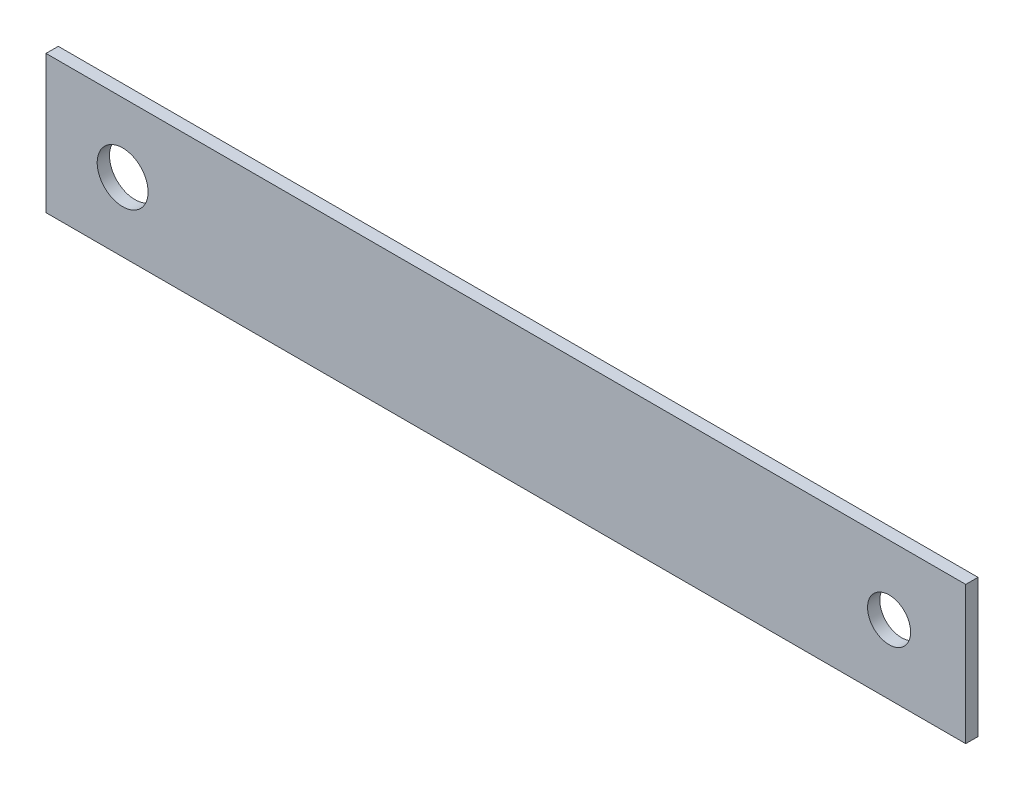
ISO-10303-21;
HEADER;
FILE_DESCRIPTION(('STEP AP214'),'2;1');
FILE_NAME('part.step','',(''),(''),'','','');
FILE_SCHEMA(('AUTOMOTIVE_DESIGN { 1 0 10303 214 1 1 1 1 }'));
ENDSEC;
DATA;
#1=APPLICATION_CONTEXT('core data for automotive mechanical design processes');
#2=APPLICATION_PROTOCOL_DEFINITION('international standard','automotive_design',2000,#1);
#3=PRODUCT_CONTEXT('',#1,'mechanical');
#4=PRODUCT('Part','Part','',(#3));
#5=PRODUCT_RELATED_PRODUCT_CATEGORY('part','',(#4));
#6=PRODUCT_DEFINITION_FORMATION('','',#4);
#7=PRODUCT_DEFINITION_CONTEXT('part definition',#1,'design');
#8=PRODUCT_DEFINITION('design','',#6,#7);
#9=PRODUCT_DEFINITION_SHAPE('','',#8);
#10=(LENGTH_UNIT() NAMED_UNIT(*) SI_UNIT(.MILLI.,.METRE.));
#11=(NAMED_UNIT(*) PLANE_ANGLE_UNIT() SI_UNIT($,.RADIAN.));
#12=(NAMED_UNIT(*) SI_UNIT($,.STERADIAN.) SOLID_ANGLE_UNIT());
#13=UNCERTAINTY_MEASURE_WITH_UNIT(LENGTH_MEASURE(1.E-05),#10,'distance_accuracy_value','');
#14=(GEOMETRIC_REPRESENTATION_CONTEXT(3) GLOBAL_UNCERTAINTY_ASSIGNED_CONTEXT((#13)) GLOBAL_UNIT_ASSIGNED_CONTEXT((#10,
#11,#12)) REPRESENTATION_CONTEXT('',''));
#15=CARTESIAN_POINT('',(0.,0.,0.));
#16=DIRECTION('',(0.,0.,1.));
#17=DIRECTION('',(1.,0.,0.));
#18=AXIS2_PLACEMENT_3D('',#15,#16,#17);
#19=CARTESIAN_POINT('',(-6.35,-5.715,1.016));
#20=DIRECTION('',(0.,0.,1.));
#21=DIRECTION('',(1.,0.,0.));
#22=AXIS2_PLACEMENT_3D('',#19,#20,#21);
#23=PLANE('',#22);
#24=CARTESIAN_POINT('',(0.,0.,1.016));
#25=DIRECTION('',(0.,0.,1.));
#26=DIRECTION('',(1.,0.,0.));
#27=AXIS2_PLACEMENT_3D('',#24,#25,#26);
#28=CIRCLE('',#27,2.1082);
#29=CARTESIAN_POINT('',(2.1082,0.,1.016));
#30=VERTEX_POINT('',#29);
#31=EDGE_CURVE('E103',#30,#30,#28,.T.);
#32=ORIENTED_EDGE('',*,*,#31,.F.);
#33=EDGE_LOOP('',(#32));
#34=FACE_BOUND('',#33,.T.);
#35=DIRECTION('',(0.,-1.,0.));
#36=VECTOR('',#35,1.);
#37=CARTESIAN_POINT('',(-6.35,5.715,1.016));
#38=LINE('',#37,#36);
#39=CARTESIAN_POINT('',(-6.35,5.715,1.016));
#40=VERTEX_POINT('',#39);
#41=CARTESIAN_POINT('',(-6.35,-5.715,1.016));
#42=VERTEX_POINT('',#41);
#43=EDGE_CURVE('E88',#40,#42,#38,.T.);
#44=ORIENTED_EDGE('',*,*,#43,.T.);
#45=DIRECTION('',(1.,0.,0.));
#46=VECTOR('',#45,1.);
#47=CARTESIAN_POINT('',(-6.35,-5.715,1.016));
#48=LINE('',#47,#46);
#49=CARTESIAN_POINT('',(69.85,-5.715,1.016));
#50=VERTEX_POINT('',#49);
#51=EDGE_CURVE('E83',#42,#50,#48,.T.);
#52=ORIENTED_EDGE('',*,*,#51,.T.);
#53=DIRECTION('',(0.,1.,0.));
#54=VECTOR('',#53,1.);
#55=CARTESIAN_POINT('',(69.85,5.715,1.016));
#56=LINE('',#55,#54);
#57=CARTESIAN_POINT('',(69.85,5.715,1.016));
#58=VERTEX_POINT('',#57);
#59=EDGE_CURVE('E86',#50,#58,#56,.T.);
#60=ORIENTED_EDGE('',*,*,#59,.T.);
#61=DIRECTION('',(-1.,0.,0.));
#62=VECTOR('',#61,1.);
#63=CARTESIAN_POINT('',(-6.35,5.715,1.016));
#64=LINE('',#63,#62);
#65=EDGE_CURVE('E53',#58,#40,#64,.T.);
#66=ORIENTED_EDGE('',*,*,#65,.T.);
#67=EDGE_LOOP('',(#44,#52,#60,#66));
#68=FACE_BOUND('',#67,.T.);
#69=CARTESIAN_POINT('',(63.5,0.,1.016));
#70=DIRECTION('',(0.,0.,1.));
#71=DIRECTION('',(1.,0.,0.));
#72=AXIS2_PLACEMENT_3D('',#69,#70,#71);
#73=CIRCLE('',#72,1.78562);
#74=CARTESIAN_POINT('',(65.28562,0.,1.016));
#75=VERTEX_POINT('',#74);
#76=EDGE_CURVE('E118',#75,#75,#73,.T.);
#77=ORIENTED_EDGE('',*,*,#76,.F.);
#78=EDGE_LOOP('',(#77));
#79=FACE_BOUND('',#78,.T.);
#80=ADVANCED_FACE('F36',(#34,#68,#79),#23,.T.);
#81=CARTESIAN_POINT('',(-6.35,-5.715,0.));
#82=DIRECTION('',(0.,0.,1.));
#83=DIRECTION('',(1.,0.,0.));
#84=AXIS2_PLACEMENT_3D('',#81,#82,#83);
#85=PLANE('',#84);
#86=CARTESIAN_POINT('',(0.,0.,0.));
#87=DIRECTION('',(0.,0.,1.));
#88=DIRECTION('',(1.,0.,0.));
#89=AXIS2_PLACEMENT_3D('',#86,#87,#88);
#90=CIRCLE('',#89,2.1082);
#91=CARTESIAN_POINT('',(2.1082,0.,0.));
#92=VERTEX_POINT('',#91);
#93=EDGE_CURVE('E115',#92,#92,#90,.T.);
#94=ORIENTED_EDGE('',*,*,#93,.T.);
#95=EDGE_LOOP('',(#94));
#96=FACE_BOUND('',#95,.T.);
#97=DIRECTION('',(0.,-1.,0.));
#98=VECTOR('',#97,1.);
#99=CARTESIAN_POINT('',(-6.35,5.715,0.));
#100=LINE('',#99,#98);
#101=CARTESIAN_POINT('',(-6.35,5.715,0.));
#102=VERTEX_POINT('',#101);
#103=CARTESIAN_POINT('',(-6.35,-5.715,0.));
#104=VERTEX_POINT('',#103);
#105=EDGE_CURVE('E100',#102,#104,#100,.T.);
#106=ORIENTED_EDGE('',*,*,#105,.F.);
#107=DIRECTION('',(-1.,0.,0.));
#108=VECTOR('',#107,1.);
#109=CARTESIAN_POINT('',(-6.35,5.715,0.));
#110=LINE('',#109,#108);
#111=CARTESIAN_POINT('',(69.85,5.715,0.));
#112=VERTEX_POINT('',#111);
#113=EDGE_CURVE('E76',#112,#102,#110,.T.);
#114=ORIENTED_EDGE('',*,*,#113,.F.);
#115=DIRECTION('',(0.,1.,0.));
#116=VECTOR('',#115,1.);
#117=CARTESIAN_POINT('',(69.85,5.715,0.));
#118=LINE('',#117,#116);
#119=CARTESIAN_POINT('',(69.85,-5.715,0.));
#120=VERTEX_POINT('',#119);
#121=EDGE_CURVE('E70',#120,#112,#118,.T.);
#122=ORIENTED_EDGE('',*,*,#121,.F.);
#123=DIRECTION('',(1.,0.,0.));
#124=VECTOR('',#123,1.);
#125=CARTESIAN_POINT('',(-6.35,-5.715,0.));
#126=LINE('',#125,#124);
#127=EDGE_CURVE('E92',#104,#120,#126,.T.);
#128=ORIENTED_EDGE('',*,*,#127,.F.);
#129=EDGE_LOOP('',(#106,#114,#122,#128));
#130=FACE_BOUND('',#129,.T.);
#131=CARTESIAN_POINT('',(63.5,0.,0.));
#132=DIRECTION('',(0.,0.,1.));
#133=DIRECTION('',(1.,0.,0.));
#134=AXIS2_PLACEMENT_3D('',#131,#132,#133);
#135=CIRCLE('',#134,1.78562);
#136=CARTESIAN_POINT('',(65.28562,0.,0.));
#137=VERTEX_POINT('',#136);
#138=EDGE_CURVE('E121',#137,#137,#135,.T.);
#139=ORIENTED_EDGE('',*,*,#138,.T.);
#140=EDGE_LOOP('',(#139));
#141=FACE_BOUND('',#140,.T.);
#142=ADVANCED_FACE('F111',(#96,#130,#141),#85,.F.);
#143=CARTESIAN_POINT('',(-6.35,5.715,1.016));
#144=DIRECTION('',(1.,0.,0.));
#145=DIRECTION('',(0.,0.,-1.));
#146=AXIS2_PLACEMENT_3D('',#143,#144,#145);
#147=PLANE('',#146);
#148=ORIENTED_EDGE('',*,*,#105,.T.);
#149=DIRECTION('',(0.,0.,-1.));
#150=VECTOR('',#149,1.);
#151=CARTESIAN_POINT('',(-6.35,-5.715,1.016));
#152=LINE('',#151,#150);
#153=EDGE_CURVE('E11',#42,#104,#152,.T.);
#154=ORIENTED_EDGE('',*,*,#153,.F.);
#155=ORIENTED_EDGE('',*,*,#43,.F.);
#156=DIRECTION('',(0.,0.,-1.));
#157=VECTOR('',#156,1.);
#158=CARTESIAN_POINT('',(-6.35,5.715,1.016));
#159=LINE('',#158,#157);
#160=EDGE_CURVE('E96',#40,#102,#159,.T.);
#161=ORIENTED_EDGE('',*,*,#160,.T.);
#162=EDGE_LOOP('',(#148,#154,#155,#161));
#163=FACE_BOUND('',#162,.T.);
#164=ADVANCED_FACE('F38',(#163),#147,.F.);
#165=CARTESIAN_POINT('',(-6.35,-5.715,1.016));
#166=DIRECTION('',(0.,1.,0.));
#167=DIRECTION('',(0.,0.,1.));
#168=AXIS2_PLACEMENT_3D('',#165,#166,#167);
#169=PLANE('',#168);
#170=ORIENTED_EDGE('',*,*,#127,.T.);
#171=DIRECTION('',(0.,0.,-1.));
#172=VECTOR('',#171,1.);
#173=CARTESIAN_POINT('',(69.85,-5.715,1.016));
#174=LINE('',#173,#172);
#175=EDGE_CURVE('E45',#50,#120,#174,.T.);
#176=ORIENTED_EDGE('',*,*,#175,.F.);
#177=ORIENTED_EDGE('',*,*,#51,.F.);
#178=ORIENTED_EDGE('',*,*,#153,.T.);
#179=EDGE_LOOP('',(#170,#176,#177,#178));
#180=FACE_BOUND('',#179,.T.);
#181=ADVANCED_FACE('F91',(#180),#169,.F.);
#182=CARTESIAN_POINT('',(69.85,5.715,1.016));
#183=DIRECTION('',(-1.,0.,0.));
#184=DIRECTION('',(0.,0.,1.));
#185=AXIS2_PLACEMENT_3D('',#182,#183,#184);
#186=PLANE('',#185);
#187=ORIENTED_EDGE('',*,*,#121,.T.);
#188=DIRECTION('',(0.,0.,-1.));
#189=VECTOR('',#188,1.);
#190=CARTESIAN_POINT('',(69.85,5.715,1.016));
#191=LINE('',#190,#189);
#192=EDGE_CURVE('E93',#58,#112,#191,.T.);
#193=ORIENTED_EDGE('',*,*,#192,.F.);
#194=ORIENTED_EDGE('',*,*,#59,.F.);
#195=ORIENTED_EDGE('',*,*,#175,.T.);
#196=EDGE_LOOP('',(#187,#193,#194,#195));
#197=FACE_BOUND('',#196,.T.);
#198=ADVANCED_FACE('F94',(#197),#186,.F.);
#199=CARTESIAN_POINT('',(-6.35,5.715,1.016));
#200=DIRECTION('',(0.,-1.,0.));
#201=DIRECTION('',(0.,0.,-1.));
#202=AXIS2_PLACEMENT_3D('',#199,#200,#201);
#203=PLANE('',#202);
#204=ORIENTED_EDGE('',*,*,#113,.T.);
#205=ORIENTED_EDGE('',*,*,#160,.F.);
#206=ORIENTED_EDGE('',*,*,#65,.F.);
#207=ORIENTED_EDGE('',*,*,#192,.T.);
#208=EDGE_LOOP('',(#204,#205,#206,#207));
#209=FACE_BOUND('',#208,.T.);
#210=ADVANCED_FACE('F108',(#209),#203,.F.);
#211=CARTESIAN_POINT('',(0.,0.,1.016));
#212=DIRECTION('',(0.,0.,-1.));
#213=DIRECTION('',(-1.,0.,0.));
#214=AXIS2_PLACEMENT_3D('',#211,#212,#213);
#215=CYLINDRICAL_SURFACE('',#214,2.1082);
#216=ORIENTED_EDGE('',*,*,#31,.T.);
#217=EDGE_LOOP('',(#216));
#218=FACE_BOUND('',#217,.T.);
#219=ORIENTED_EDGE('',*,*,#93,.F.);
#220=EDGE_LOOP('',(#219));
#221=FACE_BOUND('',#220,.T.);
#222=ADVANCED_FACE('F139',(#218,#221),#215,.F.);
#223=CARTESIAN_POINT('',(63.5,0.,1.016));
#224=DIRECTION('',(0.,0.,-1.));
#225=DIRECTION('',(-1.,0.,0.));
#226=AXIS2_PLACEMENT_3D('',#223,#224,#225);
#227=CYLINDRICAL_SURFACE('',#226,1.78562);
#228=ORIENTED_EDGE('',*,*,#76,.T.);
#229=EDGE_LOOP('',(#228));
#230=FACE_BOUND('',#229,.T.);
#231=ORIENTED_EDGE('',*,*,#138,.F.);
#232=EDGE_LOOP('',(#231));
#233=FACE_BOUND('',#232,.T.);
#234=ADVANCED_FACE('F127',(#230,#233),#227,.F.);
#235=CLOSED_SHELL('',(#80,#142,#164,#181,#198,#210,#222,#234));
#236=MANIFOLD_SOLID_BREP('B2',#235);
#237=ADVANCED_BREP_SHAPE_REPRESENTATION('',(#18,#236),#14);
#238=SHAPE_DEFINITION_REPRESENTATION(#9,#237);
ENDSEC;
END-ISO-10303-21;
